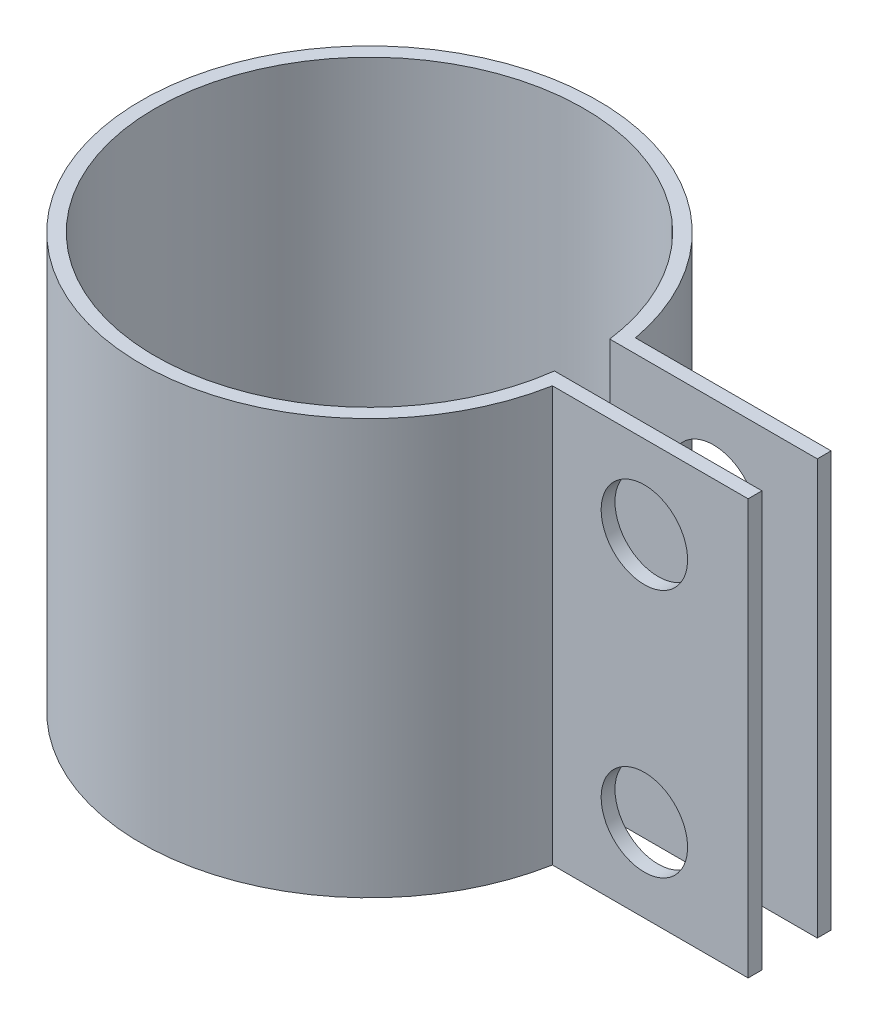
ISO-10303-21;
HEADER;
FILE_DESCRIPTION(('STEP AP214'),'2;1');
FILE_NAME('part.step','',(''),(''),'','','');
FILE_SCHEMA(('AUTOMOTIVE_DESIGN { 1 0 10303 214 1 1 1 1 }'));
ENDSEC;
DATA;
#1=APPLICATION_CONTEXT('core data for automotive mechanical design processes');
#2=APPLICATION_PROTOCOL_DEFINITION('international standard','automotive_design',2000,#1);
#3=PRODUCT_CONTEXT('',#1,'mechanical');
#4=PRODUCT('Part','Part','',(#3));
#5=PRODUCT_RELATED_PRODUCT_CATEGORY('part','',(#4));
#6=PRODUCT_DEFINITION_FORMATION('','',#4);
#7=PRODUCT_DEFINITION_CONTEXT('part definition',#1,'design');
#8=PRODUCT_DEFINITION('design','',#6,#7);
#9=PRODUCT_DEFINITION_SHAPE('','',#8);
#10=(LENGTH_UNIT() NAMED_UNIT(*) SI_UNIT(.MILLI.,.METRE.));
#11=(NAMED_UNIT(*) PLANE_ANGLE_UNIT() SI_UNIT($,.RADIAN.));
#12=(NAMED_UNIT(*) SI_UNIT($,.STERADIAN.) SOLID_ANGLE_UNIT());
#13=UNCERTAINTY_MEASURE_WITH_UNIT(LENGTH_MEASURE(1.E-05),#10,'distance_accuracy_value','');
#14=(GEOMETRIC_REPRESENTATION_CONTEXT(3) GLOBAL_UNCERTAINTY_ASSIGNED_CONTEXT((#13)) GLOBAL_UNIT_ASSIGNED_CONTEXT((#10,
#11,#12)) REPRESENTATION_CONTEXT('',''));
#15=CARTESIAN_POINT('',(0.,0.,0.));
#16=DIRECTION('',(0.,0.,1.));
#17=DIRECTION('',(1.,0.,0.));
#18=AXIS2_PLACEMENT_3D('',#15,#16,#17);
#19=CARTESIAN_POINT('',(3.24499614791759,6.,-0.6));
#20=DIRECTION('',(0.,0.,1.));
#21=DIRECTION('',(1.,0.,0.));
#22=AXIS2_PLACEMENT_3D('',#19,#20,#21);
#23=PLANE('',#22);
#24=CARTESIAN_POINT('',(4.57408522978788,1.2,-0.6));
#25=DIRECTION('',(0.,0.,-1.));
#26=DIRECTION('',(-1.,0.,0.));
#27=AXIS2_PLACEMENT_3D('',#24,#25,#26);
#28=CIRCLE('',#27,0.825);
#29=CARTESIAN_POINT('',(3.74908522978788,1.2,-0.6));
#30=VERTEX_POINT('',#29);
#31=EDGE_CURVE('E174',#30,#30,#28,.T.);
#32=ORIENTED_EDGE('',*,*,#31,.F.);
#33=EDGE_LOOP('',(#32));
#34=FACE_BOUND('',#33,.T.);
#35=DIRECTION('',(-1.,0.,0.));
#36=VECTOR('',#35,1.);
#37=CARTESIAN_POINT('',(3.24499614791759,0.,-0.6));
#38=LINE('',#37,#36);
#39=CARTESIAN_POINT('',(6.07408522978788,0.,-0.6));
#40=VERTEX_POINT('',#39);
#41=CARTESIAN_POINT('',(3.24499614791759,0.,-0.6));
#42=VERTEX_POINT('',#41);
#43=EDGE_CURVE('E148',#40,#42,#38,.T.);
#44=ORIENTED_EDGE('',*,*,#43,.T.);
#45=DIRECTION('',(0.,-1.,0.));
#46=VECTOR('',#45,1.);
#47=CARTESIAN_POINT('',(3.24499614791759,6.,-0.6));
#48=LINE('',#47,#46);
#49=CARTESIAN_POINT('',(3.24499614791759,6.,-0.6));
#50=VERTEX_POINT('',#49);
#51=EDGE_CURVE('E159',#50,#42,#48,.T.);
#52=ORIENTED_EDGE('',*,*,#51,.F.);
#53=DIRECTION('',(-1.,0.,0.));
#54=VECTOR('',#53,1.);
#55=CARTESIAN_POINT('',(3.24499614791759,6.,-0.6));
#56=LINE('',#55,#54);
#57=CARTESIAN_POINT('',(6.07408522978788,6.,-0.6));
#58=VERTEX_POINT('',#57);
#59=EDGE_CURVE('E187',#58,#50,#56,.T.);
#60=ORIENTED_EDGE('',*,*,#59,.F.);
#61=DIRECTION('',(0.,-1.,0.));
#62=VECTOR('',#61,1.);
#63=CARTESIAN_POINT('',(6.07408522978788,6.,-0.6));
#64=LINE('',#63,#62);
#65=EDGE_CURVE('E162',#58,#40,#64,.T.);
#66=ORIENTED_EDGE('',*,*,#65,.T.);
#67=EDGE_LOOP('',(#44,#52,#60,#66));
#68=FACE_BOUND('',#67,.T.);
#69=CARTESIAN_POINT('',(4.57408522978788,4.8,-0.6));
#70=DIRECTION('',(0.,0.,-1.));
#71=DIRECTION('',(-1.,0.,0.));
#72=AXIS2_PLACEMENT_3D('',#69,#70,#71);
#73=CIRCLE('',#72,0.825);
#74=CARTESIAN_POINT('',(3.74908522978788,4.8,-0.6));
#75=VERTEX_POINT('',#74);
#76=EDGE_CURVE('E242',#75,#75,#73,.T.);
#77=ORIENTED_EDGE('',*,*,#76,.F.);
#78=EDGE_LOOP('',(#77));
#79=FACE_BOUND('',#78,.T.);
#80=ADVANCED_FACE('F41',(#34,#68,#79),#23,.F.);
#81=CARTESIAN_POINT('',(0.,6.,0.));
#82=DIRECTION('',(0.,-1.,0.));
#83=DIRECTION('',(0.,0.,-1.));
#84=AXIS2_PLACEMENT_3D('',#81,#82,#83);
#85=CYLINDRICAL_SURFACE('',#84,3.1);
#86=CARTESIAN_POINT('',(0.,0.,0.));
#87=DIRECTION('',(0.,-1.,0.));
#88=DIRECTION('',(0.,0.,1.));
#89=AXIS2_PLACEMENT_3D('',#86,#87,#88);
#90=CIRCLE('',#89,3.1);
#91=CARTESIAN_POINT('',(3.07408522978788,0.,0.4));
#92=VERTEX_POINT('',#91);
#93=CARTESIAN_POINT('',(3.07408522978788,0.,-0.4));
#94=VERTEX_POINT('',#93);
#95=EDGE_CURVE('E140',#92,#94,#90,.T.);
#96=ORIENTED_EDGE('',*,*,#95,.T.);
#97=DIRECTION('',(0.,-1.,0.));
#98=VECTOR('',#97,1.);
#99=CARTESIAN_POINT('',(3.07408522978788,6.,-0.4));
#100=LINE('',#99,#98);
#101=CARTESIAN_POINT('',(3.07408522978788,6.,-0.4));
#102=VERTEX_POINT('',#101);
#103=EDGE_CURVE('E11',#102,#94,#100,.T.);
#104=ORIENTED_EDGE('',*,*,#103,.F.);
#105=CARTESIAN_POINT('',(0.,6.,0.));
#106=DIRECTION('',(0.,-1.,0.));
#107=DIRECTION('',(0.,0.,1.));
#108=AXIS2_PLACEMENT_3D('',#105,#106,#107);
#109=CIRCLE('',#108,3.1);
#110=CARTESIAN_POINT('',(3.07408522978788,6.,0.4));
#111=VERTEX_POINT('',#110);
#112=EDGE_CURVE('E155',#111,#102,#109,.T.);
#113=ORIENTED_EDGE('',*,*,#112,.F.);
#114=DIRECTION('',(0.,-1.,0.));
#115=VECTOR('',#114,1.);
#116=CARTESIAN_POINT('',(3.07408522978788,6.,0.4));
#117=LINE('',#116,#115);
#118=EDGE_CURVE('E136',#111,#92,#117,.T.);
#119=ORIENTED_EDGE('',*,*,#118,.T.);
#120=EDGE_LOOP('',(#96,#104,#113,#119));
#121=FACE_BOUND('',#120,.T.);
#122=ADVANCED_FACE('F43',(#121),#85,.F.);
#123=CARTESIAN_POINT('',(3.07408522978788,6.,-0.4));
#124=DIRECTION('',(0.,0.,-1.));
#125=DIRECTION('',(-1.,0.,0.));
#126=AXIS2_PLACEMENT_3D('',#123,#124,#125);
#127=PLANE('',#126);
#128=CARTESIAN_POINT('',(4.57408522978788,4.8,-0.4));
#129=DIRECTION('',(0.,0.,-1.));
#130=DIRECTION('',(-1.,0.,0.));
#131=AXIS2_PLACEMENT_3D('',#128,#129,#130);
#132=CIRCLE('',#131,0.625);
#133=CARTESIAN_POINT('',(3.94908522978788,4.8,-0.4));
#134=VERTEX_POINT('',#133);
#135=EDGE_CURVE('E240',#134,#134,#132,.T.);
#136=ORIENTED_EDGE('',*,*,#135,.T.);
#137=EDGE_LOOP('',(#136));
#138=FACE_BOUND('',#137,.T.);
#139=CARTESIAN_POINT('',(4.57408522978788,1.2,-0.4));
#140=DIRECTION('',(0.,0.,-1.));
#141=DIRECTION('',(-1.,0.,0.));
#142=AXIS2_PLACEMENT_3D('',#139,#140,#141);
#143=CIRCLE('',#142,0.625);
#144=CARTESIAN_POINT('',(3.94908522978788,1.2,-0.4));
#145=VERTEX_POINT('',#144);
#146=EDGE_CURVE('E168',#145,#145,#143,.T.);
#147=ORIENTED_EDGE('',*,*,#146,.T.);
#148=EDGE_LOOP('',(#147));
#149=FACE_BOUND('',#148,.T.);
#150=DIRECTION('',(1.,0.,0.));
#151=VECTOR('',#150,1.);
#152=CARTESIAN_POINT('',(3.07408522978788,0.,-0.4));
#153=LINE('',#152,#151);
#154=CARTESIAN_POINT('',(6.07408522978788,0.,-0.4));
#155=VERTEX_POINT('',#154);
#156=EDGE_CURVE('E143',#94,#155,#153,.T.);
#157=ORIENTED_EDGE('',*,*,#156,.T.);
#158=DIRECTION('',(0.,-1.,0.));
#159=VECTOR('',#158,1.);
#160=CARTESIAN_POINT('',(6.07408522978788,6.,-0.4));
#161=LINE('',#160,#159);
#162=CARTESIAN_POINT('',(6.07408522978788,6.,-0.4));
#163=VERTEX_POINT('',#162);
#164=EDGE_CURVE('E51',#163,#155,#161,.T.);
#165=ORIENTED_EDGE('',*,*,#164,.F.);
#166=DIRECTION('',(1.,0.,0.));
#167=VECTOR('',#166,1.);
#168=CARTESIAN_POINT('',(3.07408522978788,6.,-0.4));
#169=LINE('',#168,#167);
#170=EDGE_CURVE('E103',#102,#163,#169,.T.);
#171=ORIENTED_EDGE('',*,*,#170,.F.);
#172=ORIENTED_EDGE('',*,*,#103,.T.);
#173=EDGE_LOOP('',(#157,#165,#171,#172));
#174=FACE_BOUND('',#173,.T.);
#175=ADVANCED_FACE('F227',(#138,#149,#174),#127,.F.);
#176=CARTESIAN_POINT('',(6.07408522978788,6.,-0.6));
#177=DIRECTION('',(-1.,0.,0.));
#178=DIRECTION('',(0.,0.,1.));
#179=AXIS2_PLACEMENT_3D('',#176,#177,#178);
#180=PLANE('',#179);
#181=DIRECTION('',(0.,0.,-1.));
#182=VECTOR('',#181,1.);
#183=CARTESIAN_POINT('',(6.07408522978788,0.,-0.6));
#184=LINE('',#183,#182);
#185=EDGE_CURVE('E146',#155,#40,#184,.T.);
#186=ORIENTED_EDGE('',*,*,#185,.T.);
#187=ORIENTED_EDGE('',*,*,#65,.F.);
#188=DIRECTION('',(0.,0.,-1.));
#189=VECTOR('',#188,1.);
#190=CARTESIAN_POINT('',(6.07408522978788,6.,-0.6));
#191=LINE('',#190,#189);
#192=EDGE_CURVE('E185',#163,#58,#191,.T.);
#193=ORIENTED_EDGE('',*,*,#192,.F.);
#194=ORIENTED_EDGE('',*,*,#164,.T.);
#195=EDGE_LOOP('',(#186,#187,#193,#194));
#196=FACE_BOUND('',#195,.T.);
#197=ADVANCED_FACE('F232',(#196),#180,.F.);
#198=CARTESIAN_POINT('',(0.,6.,0.));
#199=DIRECTION('',(0.,-1.,0.));
#200=DIRECTION('',(0.,0.,-1.));
#201=AXIS2_PLACEMENT_3D('',#198,#199,#200);
#202=CYLINDRICAL_SURFACE('',#201,3.3);
#203=CARTESIAN_POINT('',(0.,0.,0.));
#204=DIRECTION('',(0.,1.,0.));
#205=DIRECTION('',(0.,0.,1.));
#206=AXIS2_PLACEMENT_3D('',#203,#204,#205);
#207=CIRCLE('',#206,3.3);
#208=CARTESIAN_POINT('',(3.24499614791759,0.,0.599999999999999));
#209=VERTEX_POINT('',#208);
#210=EDGE_CURVE('E150',#42,#209,#207,.T.);
#211=ORIENTED_EDGE('',*,*,#210,.T.);
#212=DIRECTION('',(0.,-1.,0.));
#213=VECTOR('',#212,1.);
#214=CARTESIAN_POINT('',(3.24499614791759,6.,0.599999999999999));
#215=LINE('',#214,#213);
#216=CARTESIAN_POINT('',(3.24499614791759,6.,0.599999999999999));
#217=VERTEX_POINT('',#216);
#218=EDGE_CURVE('E131',#217,#209,#215,.T.);
#219=ORIENTED_EDGE('',*,*,#218,.F.);
#220=CARTESIAN_POINT('',(0.,6.,0.));
#221=DIRECTION('',(0.,1.,0.));
#222=DIRECTION('',(0.,0.,1.));
#223=AXIS2_PLACEMENT_3D('',#220,#221,#222);
#224=CIRCLE('',#223,3.3);
#225=EDGE_CURVE('E122',#50,#217,#224,.T.);
#226=ORIENTED_EDGE('',*,*,#225,.F.);
#227=ORIENTED_EDGE('',*,*,#51,.T.);
#228=EDGE_LOOP('',(#211,#219,#226,#227));
#229=FACE_BOUND('',#228,.T.);
#230=ADVANCED_FACE('F197',(#229),#202,.T.);
#231=CARTESIAN_POINT('',(3.24499614791759,6.,0.6));
#232=DIRECTION('',(0.,0.,-1.));
#233=DIRECTION('',(-1.,0.,0.));
#234=AXIS2_PLACEMENT_3D('',#231,#232,#233);
#235=PLANE('',#234);
#236=CARTESIAN_POINT('',(4.57408522978788,4.8,0.6));
#237=DIRECTION('',(0.,0.,-1.));
#238=DIRECTION('',(-1.,0.,0.));
#239=AXIS2_PLACEMENT_3D('',#236,#237,#238);
#240=CIRCLE('',#239,0.625);
#241=CARTESIAN_POINT('',(3.94908522978788,4.8,0.6));
#242=VERTEX_POINT('',#241);
#243=EDGE_CURVE('E179',#242,#242,#240,.T.);
#244=ORIENTED_EDGE('',*,*,#243,.T.);
#245=EDGE_LOOP('',(#244));
#246=FACE_BOUND('',#245,.T.);
#247=CARTESIAN_POINT('',(4.57408522978788,1.2,0.6));
#248=DIRECTION('',(0.,0.,-1.));
#249=DIRECTION('',(-1.,0.,0.));
#250=AXIS2_PLACEMENT_3D('',#247,#248,#249);
#251=CIRCLE('',#250,0.625);
#252=CARTESIAN_POINT('',(3.94908522978788,1.2,0.6));
#253=VERTEX_POINT('',#252);
#254=EDGE_CURVE('E144',#253,#253,#251,.T.);
#255=ORIENTED_EDGE('',*,*,#254,.T.);
#256=EDGE_LOOP('',(#255));
#257=FACE_BOUND('',#256,.T.);
#258=DIRECTION('',(1.,0.,0.));
#259=VECTOR('',#258,1.);
#260=CARTESIAN_POINT('',(3.24499614791759,0.,0.6));
#261=LINE('',#260,#259);
#262=CARTESIAN_POINT('',(6.07408522978788,0.,0.6));
#263=VERTEX_POINT('',#262);
#264=EDGE_CURVE('E130',#209,#263,#261,.T.);
#265=ORIENTED_EDGE('',*,*,#264,.T.);
#266=DIRECTION('',(0.,-1.,0.));
#267=VECTOR('',#266,1.);
#268=CARTESIAN_POINT('',(6.07408522978788,6.,0.6));
#269=LINE('',#268,#267);
#270=CARTESIAN_POINT('',(6.07408522978788,6.,0.6));
#271=VERTEX_POINT('',#270);
#272=EDGE_CURVE('E127',#271,#263,#269,.T.);
#273=ORIENTED_EDGE('',*,*,#272,.F.);
#274=DIRECTION('',(1.,0.,0.));
#275=VECTOR('',#274,1.);
#276=CARTESIAN_POINT('',(3.24499614791759,6.,0.6));
#277=LINE('',#276,#275);
#278=EDGE_CURVE('E116',#217,#271,#277,.T.);
#279=ORIENTED_EDGE('',*,*,#278,.F.);
#280=ORIENTED_EDGE('',*,*,#218,.T.);
#281=EDGE_LOOP('',(#265,#273,#279,#280));
#282=FACE_BOUND('',#281,.T.);
#283=ADVANCED_FACE('F128',(#246,#257,#282),#235,.F.);
#284=CARTESIAN_POINT('',(6.07408522978788,6.,0.6));
#285=DIRECTION('',(-1.,0.,0.));
#286=DIRECTION('',(0.,0.,1.));
#287=AXIS2_PLACEMENT_3D('',#284,#285,#286);
#288=PLANE('',#287);
#289=DIRECTION('',(0.,0.,-1.));
#290=VECTOR('',#289,1.);
#291=CARTESIAN_POINT('',(6.07408522978788,0.,0.6));
#292=LINE('',#291,#290);
#293=CARTESIAN_POINT('',(6.07408522978788,0.,0.4));
#294=VERTEX_POINT('',#293);
#295=EDGE_CURVE('E89',#263,#294,#292,.T.);
#296=ORIENTED_EDGE('',*,*,#295,.T.);
#297=DIRECTION('',(0.,-1.,0.));
#298=VECTOR('',#297,1.);
#299=CARTESIAN_POINT('',(6.07408522978788,6.,0.4));
#300=LINE('',#299,#298);
#301=CARTESIAN_POINT('',(6.07408522978788,6.,0.4));
#302=VERTEX_POINT('',#301);
#303=EDGE_CURVE('E132',#302,#294,#300,.T.);
#304=ORIENTED_EDGE('',*,*,#303,.F.);
#305=DIRECTION('',(0.,0.,-1.));
#306=VECTOR('',#305,1.);
#307=CARTESIAN_POINT('',(6.07408522978788,6.,0.6));
#308=LINE('',#307,#306);
#309=EDGE_CURVE('E120',#271,#302,#308,.T.);
#310=ORIENTED_EDGE('',*,*,#309,.F.);
#311=ORIENTED_EDGE('',*,*,#272,.T.);
#312=EDGE_LOOP('',(#296,#304,#310,#311));
#313=FACE_BOUND('',#312,.T.);
#314=ADVANCED_FACE('F134',(#313),#288,.F.);
#315=CARTESIAN_POINT('',(6.07408522978788,6.,0.4));
#316=DIRECTION('',(0.,0.,1.));
#317=DIRECTION('',(1.,0.,0.));
#318=AXIS2_PLACEMENT_3D('',#315,#316,#317);
#319=PLANE('',#318);
#320=CARTESIAN_POINT('',(4.57408522978788,4.8,0.4));
#321=DIRECTION('',(0.,0.,1.));
#322=DIRECTION('',(1.,0.,0.));
#323=AXIS2_PLACEMENT_3D('',#320,#321,#322);
#324=CIRCLE('',#323,0.625);
#325=CARTESIAN_POINT('',(5.19908522978788,4.8,0.4));
#326=VERTEX_POINT('',#325);
#327=EDGE_CURVE('E45',#326,#326,#324,.T.);
#328=ORIENTED_EDGE('',*,*,#327,.T.);
#329=EDGE_LOOP('',(#328));
#330=FACE_BOUND('',#329,.T.);
#331=CARTESIAN_POINT('',(4.57408522978788,1.2,0.4));
#332=DIRECTION('',(0.,0.,1.));
#333=DIRECTION('',(1.,0.,0.));
#334=AXIS2_PLACEMENT_3D('',#331,#332,#333);
#335=CIRCLE('',#334,0.625);
#336=CARTESIAN_POINT('',(5.19908522978788,1.2,0.4));
#337=VERTEX_POINT('',#336);
#338=EDGE_CURVE('E166',#337,#337,#335,.T.);
#339=ORIENTED_EDGE('',*,*,#338,.T.);
#340=EDGE_LOOP('',(#339));
#341=FACE_BOUND('',#340,.T.);
#342=DIRECTION('',(-1.,0.,0.));
#343=VECTOR('',#342,1.);
#344=CARTESIAN_POINT('',(6.07408522978788,0.,0.4));
#345=LINE('',#344,#343);
#346=EDGE_CURVE('E95',#294,#92,#345,.T.);
#347=ORIENTED_EDGE('',*,*,#346,.T.);
#348=ORIENTED_EDGE('',*,*,#118,.F.);
#349=DIRECTION('',(-1.,0.,0.));
#350=VECTOR('',#349,1.);
#351=CARTESIAN_POINT('',(6.07408522978788,6.,0.4));
#352=LINE('',#351,#350);
#353=EDGE_CURVE('E60',#302,#111,#352,.T.);
#354=ORIENTED_EDGE('',*,*,#353,.F.);
#355=ORIENTED_EDGE('',*,*,#303,.T.);
#356=EDGE_LOOP('',(#347,#348,#354,#355));
#357=FACE_BOUND('',#356,.T.);
#358=ADVANCED_FACE('F205',(#330,#341,#357),#319,.F.);
#359=CARTESIAN_POINT('',(0.,6.,0.));
#360=DIRECTION('',(0.,1.,0.));
#361=DIRECTION('',(0.,0.,1.));
#362=AXIS2_PLACEMENT_3D('',#359,#360,#361);
#363=PLANE('',#362);
#364=ORIENTED_EDGE('',*,*,#112,.T.);
#365=ORIENTED_EDGE('',*,*,#170,.T.);
#366=ORIENTED_EDGE('',*,*,#192,.T.);
#367=ORIENTED_EDGE('',*,*,#59,.T.);
#368=ORIENTED_EDGE('',*,*,#225,.T.);
#369=ORIENTED_EDGE('',*,*,#278,.T.);
#370=ORIENTED_EDGE('',*,*,#309,.T.);
#371=ORIENTED_EDGE('',*,*,#353,.T.);
#372=EDGE_LOOP('',(#364,#365,#366,#367,#368,#369,#370,#371));
#373=FACE_BOUND('',#372,.T.);
#374=ADVANCED_FACE('F118',(#373),#363,.T.);
#375=CARTESIAN_POINT('',(0.,0.,0.));
#376=DIRECTION('',(0.,1.,0.));
#377=DIRECTION('',(0.,0.,1.));
#378=AXIS2_PLACEMENT_3D('',#375,#376,#377);
#379=PLANE('',#378);
#380=ORIENTED_EDGE('',*,*,#95,.F.);
#381=ORIENTED_EDGE('',*,*,#346,.F.);
#382=ORIENTED_EDGE('',*,*,#295,.F.);
#383=ORIENTED_EDGE('',*,*,#264,.F.);
#384=ORIENTED_EDGE('',*,*,#210,.F.);
#385=ORIENTED_EDGE('',*,*,#43,.F.);
#386=ORIENTED_EDGE('',*,*,#185,.F.);
#387=ORIENTED_EDGE('',*,*,#156,.F.);
#388=EDGE_LOOP('',(#380,#381,#382,#383,#384,#385,#386,#387));
#389=FACE_BOUND('',#388,.T.);
#390=ADVANCED_FACE('F200',(#389),#379,.F.);
#391=CARTESIAN_POINT('',(4.57408522978788,1.2,-0.6));
#392=DIRECTION('',(0.,0.,-1.));
#393=DIRECTION('',(-1.,0.,0.));
#394=AXIS2_PLACEMENT_3D('',#391,#392,#393);
#395=CONICAL_SURFACE('',#394,0.825,0.785398163397451);
#396=ORIENTED_EDGE('',*,*,#146,.F.);
#397=EDGE_LOOP('',(#396));
#398=FACE_BOUND('',#397,.T.);
#399=ORIENTED_EDGE('',*,*,#31,.T.);
#400=EDGE_LOOP('',(#399));
#401=FACE_BOUND('',#400,.T.);
#402=ADVANCED_FACE('F264',(#398,#401),#395,.F.);
#403=CARTESIAN_POINT('',(4.57408522978788,1.2,-0.6));
#404=DIRECTION('',(0.,0.,-1.));
#405=DIRECTION('',(-1.,0.,0.));
#406=AXIS2_PLACEMENT_3D('',#403,#404,#405);
#407=CYLINDRICAL_SURFACE('',#406,0.625);
#408=ORIENTED_EDGE('',*,*,#338,.F.);
#409=EDGE_LOOP('',(#408));
#410=FACE_BOUND('',#409,.T.);
#411=ORIENTED_EDGE('',*,*,#254,.F.);
#412=EDGE_LOOP('',(#411));
#413=FACE_BOUND('',#412,.T.);
#414=ADVANCED_FACE('F260',(#410,#413),#407,.F.);
#415=CARTESIAN_POINT('',(4.57408522978788,4.8,-0.6));
#416=DIRECTION('',(0.,0.,-1.));
#417=DIRECTION('',(-1.,0.,0.));
#418=AXIS2_PLACEMENT_3D('',#415,#416,#417);
#419=CONICAL_SURFACE('',#418,0.825,0.785398163397451);
#420=ORIENTED_EDGE('',*,*,#135,.F.);
#421=EDGE_LOOP('',(#420));
#422=FACE_BOUND('',#421,.T.);
#423=ORIENTED_EDGE('',*,*,#76,.T.);
#424=EDGE_LOOP('',(#423));
#425=FACE_BOUND('',#424,.T.);
#426=ADVANCED_FACE('F253',(#422,#425),#419,.F.);
#427=CARTESIAN_POINT('',(4.57408522978788,4.8,-0.6));
#428=DIRECTION('',(0.,0.,-1.));
#429=DIRECTION('',(-1.,0.,0.));
#430=AXIS2_PLACEMENT_3D('',#427,#428,#429);
#431=CYLINDRICAL_SURFACE('',#430,0.625);
#432=ORIENTED_EDGE('',*,*,#327,.F.);
#433=EDGE_LOOP('',(#432));
#434=FACE_BOUND('',#433,.T.);
#435=ORIENTED_EDGE('',*,*,#243,.F.);
#436=EDGE_LOOP('',(#435));
#437=FACE_BOUND('',#436,.T.);
#438=ADVANCED_FACE('F251',(#434,#437),#431,.F.);
#439=CLOSED_SHELL('',(#80,#122,#175,#197,#230,#283,#314,#358,#374,#390,#402,#414,#426,#438));
#440=MANIFOLD_SOLID_BREP('B2',#439);
#441=ADVANCED_BREP_SHAPE_REPRESENTATION('',(#18,#440),#14);
#442=SHAPE_DEFINITION_REPRESENTATION(#9,#441);
ENDSEC;
END-ISO-10303-21;
